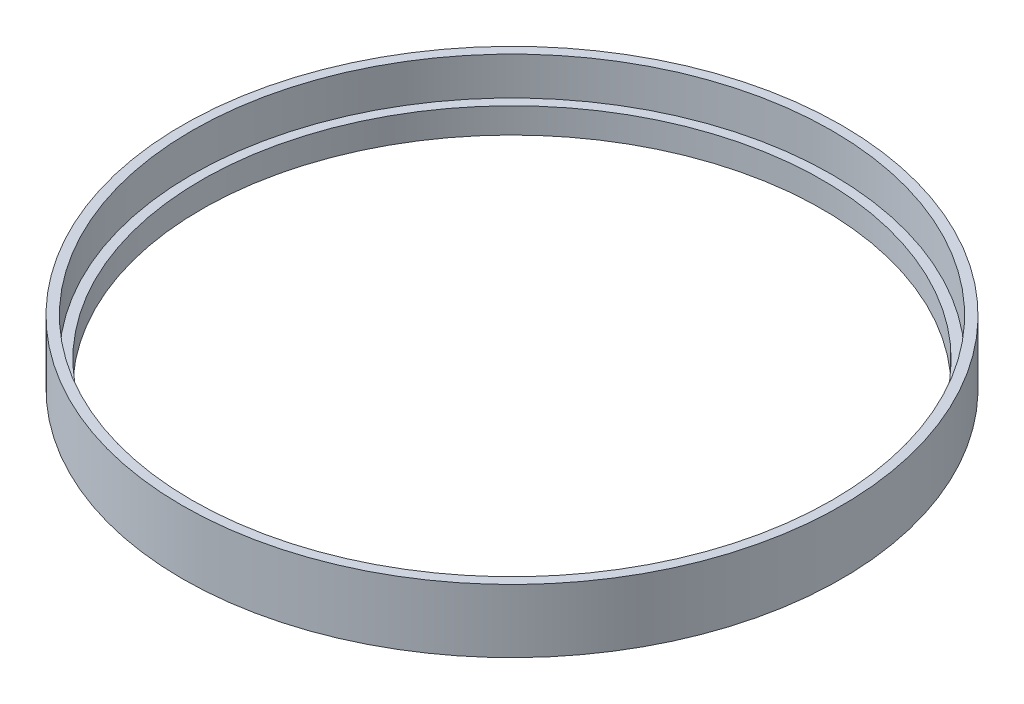
ISO-10303-21;
HEADER;
FILE_DESCRIPTION(('STEP AP214'),'2;1');
FILE_NAME('part.step','',(''),(''),'','','');
FILE_SCHEMA(('AUTOMOTIVE_DESIGN { 1 0 10303 214 1 1 1 1 }'));
ENDSEC;
DATA;
#1=APPLICATION_CONTEXT('core data for automotive mechanical design processes');
#2=APPLICATION_PROTOCOL_DEFINITION('international standard','automotive_design',2000,#1);
#3=PRODUCT_CONTEXT('',#1,'mechanical');
#4=PRODUCT('Part','Part','',(#3));
#5=PRODUCT_RELATED_PRODUCT_CATEGORY('part','',(#4));
#6=PRODUCT_DEFINITION_FORMATION('','',#4);
#7=PRODUCT_DEFINITION_CONTEXT('part definition',#1,'design');
#8=PRODUCT_DEFINITION('design','',#6,#7);
#9=PRODUCT_DEFINITION_SHAPE('','',#8);
#10=(LENGTH_UNIT() NAMED_UNIT(*) SI_UNIT(.MILLI.,.METRE.));
#11=(NAMED_UNIT(*) PLANE_ANGLE_UNIT() SI_UNIT($,.RADIAN.));
#12=(NAMED_UNIT(*) SI_UNIT($,.STERADIAN.) SOLID_ANGLE_UNIT());
#13=UNCERTAINTY_MEASURE_WITH_UNIT(LENGTH_MEASURE(1.E-05),#10,'distance_accuracy_value','');
#14=(GEOMETRIC_REPRESENTATION_CONTEXT(3) GLOBAL_UNCERTAINTY_ASSIGNED_CONTEXT((#13)) GLOBAL_UNIT_ASSIGNED_CONTEXT((#10,
#11,#12)) REPRESENTATION_CONTEXT('',''));
#15=CARTESIAN_POINT('',(0.,0.,0.));
#16=DIRECTION('',(0.,0.,1.));
#17=DIRECTION('',(1.,0.,0.));
#18=AXIS2_PLACEMENT_3D('',#15,#16,#17);
#19=CARTESIAN_POINT('',(0.,5.,0.));
#20=DIRECTION('',(0.,-1.,0.));
#21=DIRECTION('',(0.,0.,-1.));
#22=AXIS2_PLACEMENT_3D('',#19,#20,#21);
#23=CYLINDRICAL_SURFACE('',#22,26.);
#24=CARTESIAN_POINT('',(0.,5.,0.));
#25=DIRECTION('',(0.,1.,0.));
#26=DIRECTION('',(0.,0.,1.));
#27=AXIS2_PLACEMENT_3D('',#24,#25,#26);
#28=CIRCLE('',#27,26.);
#29=CARTESIAN_POINT('',(0.,5.,26.));
#30=VERTEX_POINT('',#29);
#31=EDGE_CURVE('E10',#30,#30,#28,.T.);
#32=ORIENTED_EDGE('',*,*,#31,.F.);
#33=EDGE_LOOP('',(#32));
#34=FACE_BOUND('',#33,.T.);
#35=CARTESIAN_POINT('',(0.,0.,0.));
#36=DIRECTION('',(0.,1.,0.));
#37=DIRECTION('',(0.,0.,1.));
#38=AXIS2_PLACEMENT_3D('',#35,#36,#37);
#39=CIRCLE('',#38,26.);
#40=CARTESIAN_POINT('',(0.,0.,26.));
#41=VERTEX_POINT('',#40);
#42=EDGE_CURVE('E38',#41,#41,#39,.T.);
#43=ORIENTED_EDGE('',*,*,#42,.T.);
#44=EDGE_LOOP('',(#43));
#45=FACE_BOUND('',#44,.T.);
#46=ADVANCED_FACE('F31',(#34,#45),#23,.T.);
#47=CARTESIAN_POINT('',(0.,5.,0.));
#48=DIRECTION('',(0.,1.,0.));
#49=DIRECTION('',(0.,0.,1.));
#50=AXIS2_PLACEMENT_3D('',#47,#48,#49);
#51=PLANE('',#50);
#52=CARTESIAN_POINT('',(0.,5.,0.));
#53=DIRECTION('',(0.,1.,0.));
#54=DIRECTION('',(0.,0.,1.));
#55=AXIS2_PLACEMENT_3D('',#52,#53,#54);
#56=CIRCLE('',#55,25.25);
#57=CARTESIAN_POINT('',(0.,5.,25.25));
#58=VERTEX_POINT('',#57);
#59=EDGE_CURVE('E45',#58,#58,#56,.T.);
#60=ORIENTED_EDGE('',*,*,#59,.F.);
#61=EDGE_LOOP('',(#60));
#62=FACE_BOUND('',#61,.T.);
#63=ORIENTED_EDGE('',*,*,#31,.T.);
#64=EDGE_LOOP('',(#63));
#65=FACE_BOUND('',#64,.T.);
#66=ADVANCED_FACE('F71',(#62,#65),#51,.T.);
#67=CARTESIAN_POINT('',(0.,0.,0.));
#68=DIRECTION('',(0.,1.,0.));
#69=DIRECTION('',(0.,0.,1.));
#70=AXIS2_PLACEMENT_3D('',#67,#68,#69);
#71=PLANE('',#70);
#72=CARTESIAN_POINT('',(0.,0.,0.));
#73=DIRECTION('',(0.,1.,0.));
#74=DIRECTION('',(0.,0.,1.));
#75=AXIS2_PLACEMENT_3D('',#72,#73,#74);
#76=CIRCLE('',#75,24.5);
#77=CARTESIAN_POINT('',(0.,0.,24.5));
#78=VERTEX_POINT('',#77);
#79=EDGE_CURVE('E34',#78,#78,#76,.T.);
#80=ORIENTED_EDGE('',*,*,#79,.T.);
#81=EDGE_LOOP('',(#80));
#82=FACE_BOUND('',#81,.T.);
#83=ORIENTED_EDGE('',*,*,#42,.F.);
#84=EDGE_LOOP('',(#83));
#85=FACE_BOUND('',#84,.T.);
#86=ADVANCED_FACE('F57',(#82,#85),#71,.F.);
#87=CARTESIAN_POINT('',(0.,2.,0.));
#88=DIRECTION('',(0.,1.,0.));
#89=DIRECTION('',(0.,0.,1.));
#90=AXIS2_PLACEMENT_3D('',#87,#88,#89);
#91=CYLINDRICAL_SURFACE('',#90,25.25);
#92=CARTESIAN_POINT('',(0.,2.,0.));
#93=DIRECTION('',(0.,1.,0.));
#94=DIRECTION('',(0.,0.,1.));
#95=AXIS2_PLACEMENT_3D('',#92,#93,#94);
#96=CIRCLE('',#95,25.25);
#97=CARTESIAN_POINT('',(0.,2.,25.25));
#98=VERTEX_POINT('',#97);
#99=EDGE_CURVE('E43',#98,#98,#96,.T.);
#100=ORIENTED_EDGE('',*,*,#99,.F.);
#101=EDGE_LOOP('',(#100));
#102=FACE_BOUND('',#101,.T.);
#103=ORIENTED_EDGE('',*,*,#59,.T.);
#104=EDGE_LOOP('',(#103));
#105=FACE_BOUND('',#104,.T.);
#106=ADVANCED_FACE('F67',(#102,#105),#91,.F.);
#107=CARTESIAN_POINT('',(0.,2.,0.));
#108=DIRECTION('',(0.,1.,0.));
#109=DIRECTION('',(0.,0.,1.));
#110=AXIS2_PLACEMENT_3D('',#107,#108,#109);
#111=PLANE('',#110);
#112=CARTESIAN_POINT('',(0.,2.,0.));
#113=DIRECTION('',(0.,1.,0.));
#114=DIRECTION('',(0.,0.,1.));
#115=AXIS2_PLACEMENT_3D('',#112,#113,#114);
#116=CIRCLE('',#115,24.5);
#117=CARTESIAN_POINT('',(0.,2.,24.5));
#118=VERTEX_POINT('',#117);
#119=EDGE_CURVE('E50',#118,#118,#116,.T.);
#120=ORIENTED_EDGE('',*,*,#119,.F.);
#121=EDGE_LOOP('',(#120));
#122=FACE_BOUND('',#121,.T.);
#123=ORIENTED_EDGE('',*,*,#99,.T.);
#124=EDGE_LOOP('',(#123));
#125=FACE_BOUND('',#124,.T.);
#126=ADVANCED_FACE('F62',(#122,#125),#111,.T.);
#127=CARTESIAN_POINT('',(0.,-1.,0.));
#128=DIRECTION('',(0.,1.,0.));
#129=DIRECTION('',(0.,0.,1.));
#130=AXIS2_PLACEMENT_3D('',#127,#128,#129);
#131=CYLINDRICAL_SURFACE('',#130,24.5);
#132=ORIENTED_EDGE('',*,*,#119,.T.);
#133=EDGE_LOOP('',(#132));
#134=FACE_BOUND('',#133,.T.);
#135=ORIENTED_EDGE('',*,*,#79,.F.);
#136=EDGE_LOOP('',(#135));
#137=FACE_BOUND('',#136,.T.);
#138=ADVANCED_FACE('F60',(#134,#137),#131,.F.);
#139=CLOSED_SHELL('',(#46,#66,#86,#106,#126,#138));
#140=MANIFOLD_SOLID_BREP('B2',#139);
#141=ADVANCED_BREP_SHAPE_REPRESENTATION('',(#18,#140),#14);
#142=SHAPE_DEFINITION_REPRESENTATION(#9,#141);
ENDSEC;
END-ISO-10303-21;
